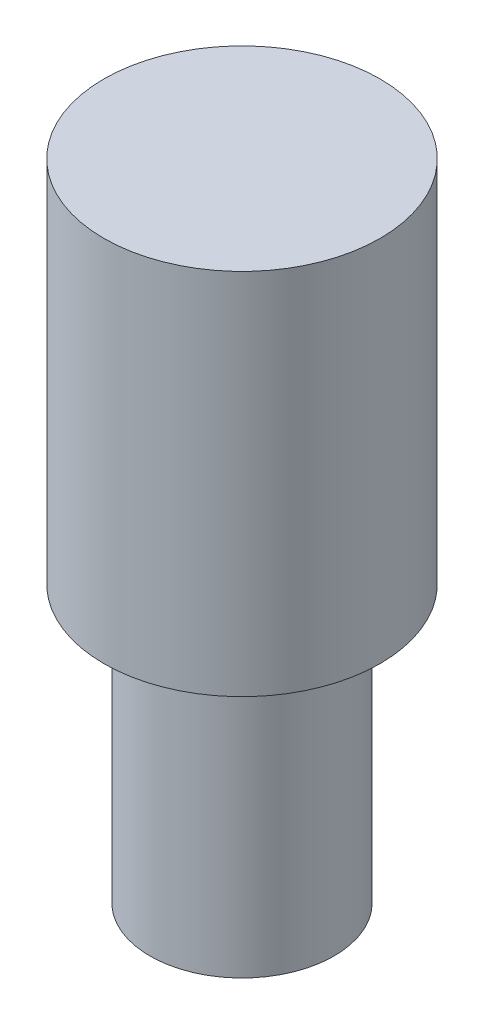
ISO-10303-21;
HEADER;
FILE_DESCRIPTION(('STEP AP214'),'2;1');
FILE_NAME('part.step','',(''),(''),'','','');
FILE_SCHEMA(('AUTOMOTIVE_DESIGN { 1 0 10303 214 1 1 1 1 }'));
ENDSEC;
DATA;
#1=APPLICATION_CONTEXT('core data for automotive mechanical design processes');
#2=APPLICATION_PROTOCOL_DEFINITION('international standard','automotive_design',2000,#1);
#3=PRODUCT_CONTEXT('',#1,'mechanical');
#4=PRODUCT('Part','Part','',(#3));
#5=PRODUCT_RELATED_PRODUCT_CATEGORY('part','',(#4));
#6=PRODUCT_DEFINITION_FORMATION('','',#4);
#7=PRODUCT_DEFINITION_CONTEXT('part definition',#1,'design');
#8=PRODUCT_DEFINITION('design','',#6,#7);
#9=PRODUCT_DEFINITION_SHAPE('','',#8);
#10=(LENGTH_UNIT() NAMED_UNIT(*) SI_UNIT(.MILLI.,.METRE.));
#11=(NAMED_UNIT(*) PLANE_ANGLE_UNIT() SI_UNIT($,.RADIAN.));
#12=(NAMED_UNIT(*) SI_UNIT($,.STERADIAN.) SOLID_ANGLE_UNIT());
#13=UNCERTAINTY_MEASURE_WITH_UNIT(LENGTH_MEASURE(1.E-05),#10,'distance_accuracy_value','');
#14=(GEOMETRIC_REPRESENTATION_CONTEXT(3) GLOBAL_UNCERTAINTY_ASSIGNED_CONTEXT((#13)) GLOBAL_UNIT_ASSIGNED_CONTEXT((#10,
#11,#12)) REPRESENTATION_CONTEXT('',''));
#15=CARTESIAN_POINT('',(0.,0.,0.));
#16=DIRECTION('',(0.,0.,1.));
#17=DIRECTION('',(1.,0.,0.));
#18=AXIS2_PLACEMENT_3D('',#15,#16,#17);
#19=CARTESIAN_POINT('',(0.,0.,0.));
#20=DIRECTION('',(0.,-1.,0.));
#21=DIRECTION('',(0.,0.,-1.));
#22=AXIS2_PLACEMENT_3D('',#19,#20,#21);
#23=PLANE('',#22);
#24=CARTESIAN_POINT('',(0.,0.,0.));
#25=DIRECTION('',(0.,-1.,0.));
#26=DIRECTION('',(0.,0.,-1.));
#27=AXIS2_PLACEMENT_3D('',#24,#25,#26);
#28=CIRCLE('',#27,1.);
#29=CARTESIAN_POINT('',(0.,0.,-1.));
#30=VERTEX_POINT('',#29);
#31=EDGE_CURVE('E10',#30,#30,#28,.T.);
#32=ORIENTED_EDGE('',*,*,#31,.T.);
#33=EDGE_LOOP('',(#32));
#34=FACE_BOUND('',#33,.T.);
#35=ADVANCED_FACE('F31',(#34),#23,.T.);
#36=CARTESIAN_POINT('',(0.,0.,0.));
#37=DIRECTION('',(0.,-1.,0.));
#38=DIRECTION('',(0.,0.,-1.));
#39=AXIS2_PLACEMENT_3D('',#36,#37,#38);
#40=CYLINDRICAL_SURFACE('',#39,1.);
#41=CARTESIAN_POINT('',(0.,3.,0.));
#42=DIRECTION('',(0.,-1.,0.));
#43=DIRECTION('',(0.,0.,-1.));
#44=AXIS2_PLACEMENT_3D('',#41,#42,#43);
#45=CIRCLE('',#44,1.);
#46=CARTESIAN_POINT('',(0.,3.,-1.));
#47=VERTEX_POINT('',#46);
#48=EDGE_CURVE('E37',#47,#47,#45,.T.);
#49=ORIENTED_EDGE('',*,*,#48,.T.);
#50=EDGE_LOOP('',(#49));
#51=FACE_BOUND('',#50,.T.);
#52=ORIENTED_EDGE('',*,*,#31,.F.);
#53=EDGE_LOOP('',(#52));
#54=FACE_BOUND('',#53,.T.);
#55=ADVANCED_FACE('F63',(#51,#54),#40,.T.);
#56=CARTESIAN_POINT('',(1.,3.,0.));
#57=DIRECTION('',(0.,-1.,0.));
#58=DIRECTION('',(0.,0.,-1.));
#59=AXIS2_PLACEMENT_3D('',#56,#57,#58);
#60=PLANE('',#59);
#61=CARTESIAN_POINT('',(0.,3.,0.));
#62=DIRECTION('',(0.,-1.,0.));
#63=DIRECTION('',(0.,0.,-1.));
#64=AXIS2_PLACEMENT_3D('',#61,#62,#63);
#65=CIRCLE('',#64,1.5);
#66=CARTESIAN_POINT('',(0.,3.,-1.5));
#67=VERTEX_POINT('',#66);
#68=EDGE_CURVE('E41',#67,#67,#65,.T.);
#69=ORIENTED_EDGE('',*,*,#68,.T.);
#70=EDGE_LOOP('',(#69));
#71=FACE_BOUND('',#70,.T.);
#72=ORIENTED_EDGE('',*,*,#48,.F.);
#73=EDGE_LOOP('',(#72));
#74=FACE_BOUND('',#73,.T.);
#75=ADVANCED_FACE('F60',(#71,#74),#60,.T.);
#76=CARTESIAN_POINT('',(0.,0.,0.));
#77=DIRECTION('',(0.,-1.,0.));
#78=DIRECTION('',(0.,0.,-1.));
#79=AXIS2_PLACEMENT_3D('',#76,#77,#78);
#80=CYLINDRICAL_SURFACE('',#79,1.5);
#81=CARTESIAN_POINT('',(0.,7.,0.));
#82=DIRECTION('',(0.,-1.,0.));
#83=DIRECTION('',(0.,0.,-1.));
#84=AXIS2_PLACEMENT_3D('',#81,#82,#83);
#85=CIRCLE('',#84,1.5);
#86=CARTESIAN_POINT('',(0.,7.,-1.5));
#87=VERTEX_POINT('',#86);
#88=EDGE_CURVE('E45',#87,#87,#85,.T.);
#89=ORIENTED_EDGE('',*,*,#88,.T.);
#90=EDGE_LOOP('',(#89));
#91=FACE_BOUND('',#90,.T.);
#92=ORIENTED_EDGE('',*,*,#68,.F.);
#93=EDGE_LOOP('',(#92));
#94=FACE_BOUND('',#93,.T.);
#95=ADVANCED_FACE('F51',(#91,#94),#80,.T.);
#96=CARTESIAN_POINT('',(0.,7.,0.));
#97=DIRECTION('',(0.,1.,0.));
#98=DIRECTION('',(0.,0.,1.));
#99=AXIS2_PLACEMENT_3D('',#96,#97,#98);
#100=PLANE('',#99);
#101=ORIENTED_EDGE('',*,*,#88,.F.);
#102=EDGE_LOOP('',(#101));
#103=FACE_BOUND('',#102,.T.);
#104=ADVANCED_FACE('F54',(#103),#100,.T.);
#105=CLOSED_SHELL('',(#35,#55,#75,#95,#104));
#106=MANIFOLD_SOLID_BREP('B2',#105);
#107=ADVANCED_BREP_SHAPE_REPRESENTATION('',(#18,#106),#14);
#108=SHAPE_DEFINITION_REPRESENTATION(#9,#107);
ENDSEC;
END-ISO-10303-21;
